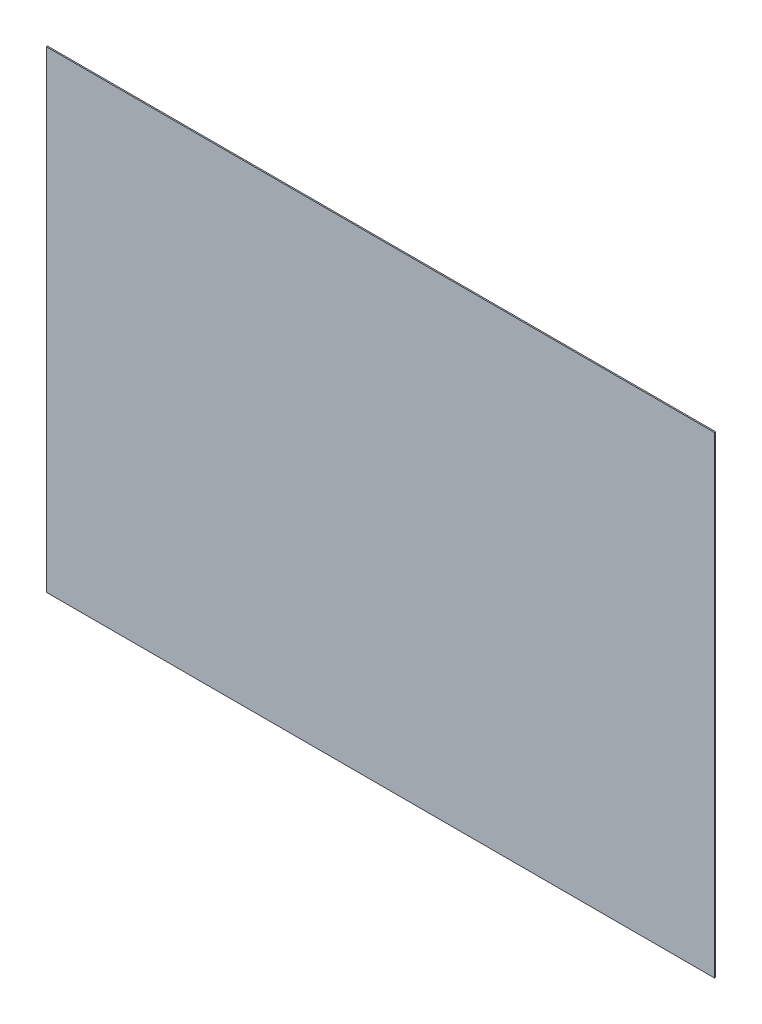
ISO-10303-21;
HEADER;
FILE_DESCRIPTION(('STEP AP214'),'2;1');
FILE_NAME('part.step','',(''),(''),'','','');
FILE_SCHEMA(('AUTOMOTIVE_DESIGN { 1 0 10303 214 1 1 1 1 }'));
ENDSEC;
DATA;
#1=APPLICATION_CONTEXT('core data for automotive mechanical design processes');
#2=APPLICATION_PROTOCOL_DEFINITION('international standard','automotive_design',2000,#1);
#3=PRODUCT_CONTEXT('',#1,'mechanical');
#4=PRODUCT('Part','Part','',(#3));
#5=PRODUCT_RELATED_PRODUCT_CATEGORY('part','',(#4));
#6=PRODUCT_DEFINITION_FORMATION('','',#4);
#7=PRODUCT_DEFINITION_CONTEXT('part definition',#1,'design');
#8=PRODUCT_DEFINITION('design','',#6,#7);
#9=PRODUCT_DEFINITION_SHAPE('','',#8);
#10=(LENGTH_UNIT() NAMED_UNIT(*) SI_UNIT(.MILLI.,.METRE.));
#11=(NAMED_UNIT(*) PLANE_ANGLE_UNIT() SI_UNIT($,.RADIAN.));
#12=(NAMED_UNIT(*) SI_UNIT($,.STERADIAN.) SOLID_ANGLE_UNIT());
#13=UNCERTAINTY_MEASURE_WITH_UNIT(LENGTH_MEASURE(1.E-05),#10,'distance_accuracy_value','');
#14=(GEOMETRIC_REPRESENTATION_CONTEXT(3) GLOBAL_UNCERTAINTY_ASSIGNED_CONTEXT((#13)) GLOBAL_UNIT_ASSIGNED_CONTEXT((#10,
#11,#12)) REPRESENTATION_CONTEXT('',''));
#15=CARTESIAN_POINT('',(0.,0.,0.));
#16=DIRECTION('',(0.,0.,1.));
#17=DIRECTION('',(1.,0.,0.));
#18=AXIS2_PLACEMENT_3D('',#15,#16,#17);
#19=CARTESIAN_POINT('',(210.,-148.5,-0.77));
#20=DIRECTION('',(1.,0.,0.));
#21=DIRECTION('',(0.,1.,0.));
#22=AXIS2_PLACEMENT_3D('',#19,#20,#21);
#23=PLANE('',#22);
#24=DIRECTION('',(0.,1.,0.));
#25=VECTOR('',#24,1.);
#26=CARTESIAN_POINT('',(210.,-148.5,0.));
#27=LINE('',#26,#25);
#28=CARTESIAN_POINT('',(210.,-148.5,0.));
#29=VERTEX_POINT('',#28);
#30=CARTESIAN_POINT('',(210.,148.5,0.));
#31=VERTEX_POINT('',#30);
#32=EDGE_CURVE('E100',#29,#31,#27,.T.);
#33=ORIENTED_EDGE('',*,*,#32,.F.);
#34=DIRECTION('',(0.,0.,1.));
#35=VECTOR('',#34,1.);
#36=CARTESIAN_POINT('',(210.,-148.5,-0.77));
#37=LINE('',#36,#35);
#38=CARTESIAN_POINT('',(210.,-148.5,-0.77));
#39=VERTEX_POINT('',#38);
#40=EDGE_CURVE('E11',#39,#29,#37,.T.);
#41=ORIENTED_EDGE('',*,*,#40,.F.);
#42=DIRECTION('',(0.,1.,0.));
#43=VECTOR('',#42,1.);
#44=CARTESIAN_POINT('',(210.,-148.5,-0.77));
#45=LINE('',#44,#43);
#46=CARTESIAN_POINT('',(210.,148.5,-0.77));
#47=VERTEX_POINT('',#46);
#48=EDGE_CURVE('E94',#39,#47,#45,.T.);
#49=ORIENTED_EDGE('',*,*,#48,.T.);
#50=DIRECTION('',(0.,0.,1.));
#51=VECTOR('',#50,1.);
#52=CARTESIAN_POINT('',(210.,148.5,-0.77));
#53=LINE('',#52,#51);
#54=EDGE_CURVE('E39',#47,#31,#53,.T.);
#55=ORIENTED_EDGE('',*,*,#54,.T.);
#56=EDGE_LOOP('',(#33,#41,#49,#55));
#57=FACE_BOUND('',#56,.T.);
#58=ADVANCED_FACE('F36',(#57),#23,.T.);
#59=CARTESIAN_POINT('',(-210.,-148.5,-0.77));
#60=DIRECTION('',(0.,-1.,0.));
#61=DIRECTION('',(0.,0.,-1.));
#62=AXIS2_PLACEMENT_3D('',#59,#60,#61);
#63=PLANE('',#62);
#64=DIRECTION('',(1.,0.,0.));
#65=VECTOR('',#64,1.);
#66=CARTESIAN_POINT('',(-210.,-148.5,0.));
#67=LINE('',#66,#65);
#68=CARTESIAN_POINT('',(-210.,-148.5,0.));
#69=VERTEX_POINT('',#68);
#70=EDGE_CURVE('E96',#69,#29,#67,.T.);
#71=ORIENTED_EDGE('',*,*,#70,.F.);
#72=DIRECTION('',(0.,0.,1.));
#73=VECTOR('',#72,1.);
#74=CARTESIAN_POINT('',(-210.,-148.5,-0.77));
#75=LINE('',#74,#73);
#76=CARTESIAN_POINT('',(-210.,-148.5,-0.77));
#77=VERTEX_POINT('',#76);
#78=EDGE_CURVE('E45',#77,#69,#75,.T.);
#79=ORIENTED_EDGE('',*,*,#78,.F.);
#80=DIRECTION('',(1.,0.,0.));
#81=VECTOR('',#80,1.);
#82=CARTESIAN_POINT('',(-210.,-148.5,-0.77));
#83=LINE('',#82,#81);
#84=EDGE_CURVE('E91',#77,#39,#83,.T.);
#85=ORIENTED_EDGE('',*,*,#84,.T.);
#86=ORIENTED_EDGE('',*,*,#40,.T.);
#87=EDGE_LOOP('',(#71,#79,#85,#86));
#88=FACE_BOUND('',#87,.T.);
#89=ADVANCED_FACE('F110',(#88),#63,.T.);
#90=CARTESIAN_POINT('',(-210.,-148.5,-0.77));
#91=DIRECTION('',(-1.,0.,0.));
#92=DIRECTION('',(0.,0.,1.));
#93=AXIS2_PLACEMENT_3D('',#90,#91,#92);
#94=PLANE('',#93);
#95=DIRECTION('',(0.,-1.,0.));
#96=VECTOR('',#95,1.);
#97=CARTESIAN_POINT('',(-210.,-148.5,0.));
#98=LINE('',#97,#96);
#99=CARTESIAN_POINT('',(-210.,148.5,0.));
#100=VERTEX_POINT('',#99);
#101=EDGE_CURVE('E86',#100,#69,#98,.T.);
#102=ORIENTED_EDGE('',*,*,#101,.F.);
#103=DIRECTION('',(0.,0.,1.));
#104=VECTOR('',#103,1.);
#105=CARTESIAN_POINT('',(-210.,148.5,-0.77));
#106=LINE('',#105,#104);
#107=CARTESIAN_POINT('',(-210.,148.5,-0.77));
#108=VERTEX_POINT('',#107);
#109=EDGE_CURVE('E81',#108,#100,#106,.T.);
#110=ORIENTED_EDGE('',*,*,#109,.F.);
#111=DIRECTION('',(0.,-1.,0.));
#112=VECTOR('',#111,1.);
#113=CARTESIAN_POINT('',(-210.,-148.5,-0.77));
#114=LINE('',#113,#112);
#115=EDGE_CURVE('E84',#108,#77,#114,.T.);
#116=ORIENTED_EDGE('',*,*,#115,.T.);
#117=ORIENTED_EDGE('',*,*,#78,.T.);
#118=EDGE_LOOP('',(#102,#110,#116,#117));
#119=FACE_BOUND('',#118,.T.);
#120=ADVANCED_FACE('F83',(#119),#94,.T.);
#121=CARTESIAN_POINT('',(-210.,148.5,-0.77));
#122=DIRECTION('',(0.,1.,0.));
#123=DIRECTION('',(0.,0.,1.));
#124=AXIS2_PLACEMENT_3D('',#121,#122,#123);
#125=PLANE('',#124);
#126=DIRECTION('',(-1.,0.,0.));
#127=VECTOR('',#126,1.);
#128=CARTESIAN_POINT('',(-210.,148.5,0.));
#129=LINE('',#128,#127);
#130=EDGE_CURVE('E103',#31,#100,#129,.T.);
#131=ORIENTED_EDGE('',*,*,#130,.F.);
#132=ORIENTED_EDGE('',*,*,#54,.F.);
#133=DIRECTION('',(-1.,0.,0.));
#134=VECTOR('',#133,1.);
#135=CARTESIAN_POINT('',(-210.,148.5,-0.77));
#136=LINE('',#135,#134);
#137=EDGE_CURVE('E90',#47,#108,#136,.T.);
#138=ORIENTED_EDGE('',*,*,#137,.T.);
#139=ORIENTED_EDGE('',*,*,#109,.T.);
#140=EDGE_LOOP('',(#131,#132,#138,#139));
#141=FACE_BOUND('',#140,.T.);
#142=ADVANCED_FACE('F93',(#141),#125,.T.);
#143=CARTESIAN_POINT('',(0.,0.,-0.77));
#144=DIRECTION('',(0.,0.,-1.));
#145=DIRECTION('',(-1.,0.,0.));
#146=AXIS2_PLACEMENT_3D('',#143,#144,#145);
#147=PLANE('',#146);
#148=ORIENTED_EDGE('',*,*,#48,.F.);
#149=ORIENTED_EDGE('',*,*,#84,.F.);
#150=ORIENTED_EDGE('',*,*,#115,.F.);
#151=ORIENTED_EDGE('',*,*,#137,.F.);
#152=EDGE_LOOP('',(#148,#149,#150,#151));
#153=FACE_BOUND('',#152,.T.);
#154=ADVANCED_FACE('F89',(#153),#147,.T.);
#155=CARTESIAN_POINT('',(0.,0.,0.));
#156=DIRECTION('',(0.,0.,-1.));
#157=DIRECTION('',(-1.,0.,0.));
#158=AXIS2_PLACEMENT_3D('',#155,#156,#157);
#159=PLANE('',#158);
#160=ORIENTED_EDGE('',*,*,#32,.T.);
#161=ORIENTED_EDGE('',*,*,#130,.T.);
#162=ORIENTED_EDGE('',*,*,#101,.T.);
#163=ORIENTED_EDGE('',*,*,#70,.T.);
#164=EDGE_LOOP('',(#160,#161,#162,#163));
#165=FACE_BOUND('',#164,.T.);
#166=ADVANCED_FACE('F109',(#165),#159,.F.);
#167=CLOSED_SHELL('',(#58,#89,#120,#142,#154,#166));
#168=MANIFOLD_SOLID_BREP('B2',#167);
#169=ADVANCED_BREP_SHAPE_REPRESENTATION('',(#18,#168),#14);
#170=SHAPE_DEFINITION_REPRESENTATION(#9,#169);
ENDSEC;
END-ISO-10303-21;
